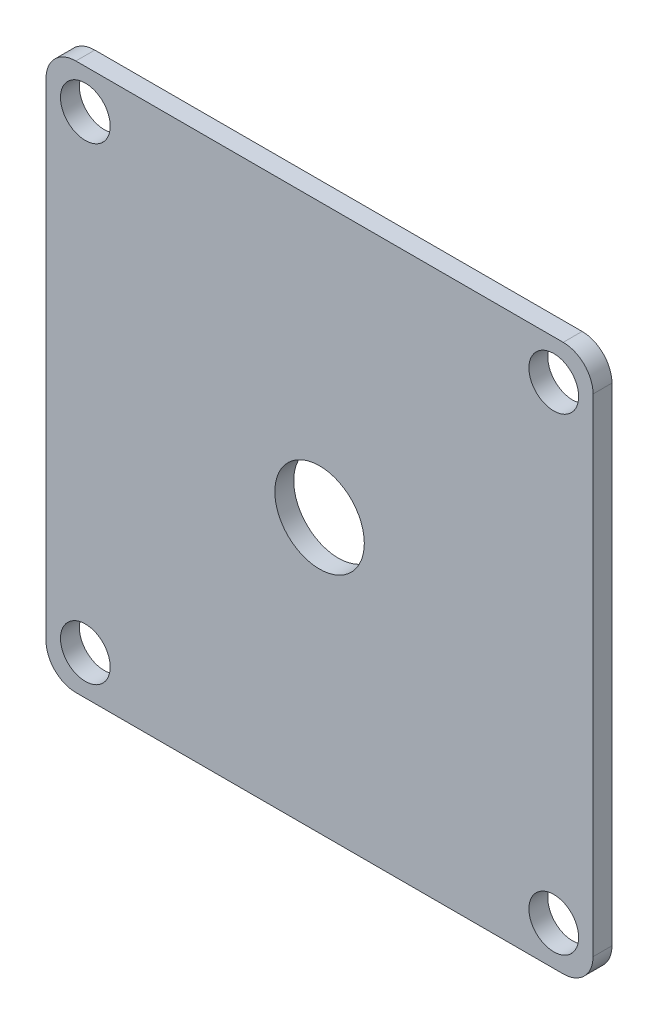
ISO-10303-21;
HEADER;
FILE_DESCRIPTION(('STEP AP214'),'2;1');
FILE_NAME('part.step','',(''),(''),'','','');
FILE_SCHEMA(('AUTOMOTIVE_DESIGN { 1 0 10303 214 1 1 1 1 }'));
ENDSEC;
DATA;
#1=APPLICATION_CONTEXT('core data for automotive mechanical design processes');
#2=APPLICATION_PROTOCOL_DEFINITION('international standard','automotive_design',2000,#1);
#3=PRODUCT_CONTEXT('',#1,'mechanical');
#4=PRODUCT('Part','Part','',(#3));
#5=PRODUCT_RELATED_PRODUCT_CATEGORY('part','',(#4));
#6=PRODUCT_DEFINITION_FORMATION('','',#4);
#7=PRODUCT_DEFINITION_CONTEXT('part definition',#1,'design');
#8=PRODUCT_DEFINITION('design','',#6,#7);
#9=PRODUCT_DEFINITION_SHAPE('','',#8);
#10=(LENGTH_UNIT() NAMED_UNIT(*) SI_UNIT(.MILLI.,.METRE.));
#11=(NAMED_UNIT(*) PLANE_ANGLE_UNIT() SI_UNIT($,.RADIAN.));
#12=(NAMED_UNIT(*) SI_UNIT($,.STERADIAN.) SOLID_ANGLE_UNIT());
#13=UNCERTAINTY_MEASURE_WITH_UNIT(LENGTH_MEASURE(1.E-05),#10,'distance_accuracy_value','');
#14=(GEOMETRIC_REPRESENTATION_CONTEXT(3) GLOBAL_UNCERTAINTY_ASSIGNED_CONTEXT((#13)) GLOBAL_UNIT_ASSIGNED_CONTEXT((#10,
#11,#12)) REPRESENTATION_CONTEXT('',''));
#15=CARTESIAN_POINT('',(0.,0.,0.));
#16=DIRECTION('',(0.,0.,1.));
#17=DIRECTION('',(1.,0.,0.));
#18=AXIS2_PLACEMENT_3D('',#15,#16,#17);
#19=CARTESIAN_POINT('',(3.,52.,1.9));
#20=DIRECTION('',(0.,0.,-1.));
#21=DIRECTION('',(-1.,0.,0.));
#22=AXIS2_PLACEMENT_3D('',#19,#20,#21);
#23=CYLINDRICAL_SURFACE('',#22,3.);
#24=CARTESIAN_POINT('',(3.,52.,0.));
#25=DIRECTION('',(0.,0.,1.));
#26=DIRECTION('',(-1.,0.,0.));
#27=AXIS2_PLACEMENT_3D('',#24,#25,#26);
#28=CIRCLE('',#27,3.);
#29=CARTESIAN_POINT('',(3.,55.,0.));
#30=VERTEX_POINT('',#29);
#31=CARTESIAN_POINT('',(0.,52.,0.));
#32=VERTEX_POINT('',#31);
#33=EDGE_CURVE('E131',#30,#32,#28,.T.);
#34=ORIENTED_EDGE('',*,*,#33,.T.);
#35=DIRECTION('',(0.,0.,-1.));
#36=VECTOR('',#35,1.);
#37=CARTESIAN_POINT('',(0.,52.,1.9));
#38=LINE('',#37,#36);
#39=CARTESIAN_POINT('',(0.,52.,1.9));
#40=VERTEX_POINT('',#39);
#41=EDGE_CURVE('E11',#40,#32,#38,.T.);
#42=ORIENTED_EDGE('',*,*,#41,.F.);
#43=CARTESIAN_POINT('',(3.,52.,1.9));
#44=DIRECTION('',(0.,0.,1.));
#45=DIRECTION('',(-1.,0.,0.));
#46=AXIS2_PLACEMENT_3D('',#43,#44,#45);
#47=CIRCLE('',#46,3.);
#48=CARTESIAN_POINT('',(3.,55.,1.9));
#49=VERTEX_POINT('',#48);
#50=EDGE_CURVE('E146',#49,#40,#47,.T.);
#51=ORIENTED_EDGE('',*,*,#50,.F.);
#52=DIRECTION('',(0.,0.,-1.));
#53=VECTOR('',#52,1.);
#54=CARTESIAN_POINT('',(3.,55.,1.9));
#55=LINE('',#54,#53);
#56=EDGE_CURVE('E127',#49,#30,#55,.T.);
#57=ORIENTED_EDGE('',*,*,#56,.T.);
#58=EDGE_LOOP('',(#34,#42,#51,#57));
#59=FACE_BOUND('',#58,.T.);
#60=ADVANCED_FACE('F35',(#59),#23,.T.);
#61=CARTESIAN_POINT('',(0.,3.00000000000002,1.9));
#62=DIRECTION('',(1.,0.,0.));
#63=DIRECTION('',(0.,0.,-1.));
#64=AXIS2_PLACEMENT_3D('',#61,#62,#63);
#65=PLANE('',#64);
#66=DIRECTION('',(0.,-1.,0.));
#67=VECTOR('',#66,1.);
#68=CARTESIAN_POINT('',(0.,3.00000000000002,0.));
#69=LINE('',#68,#67);
#70=CARTESIAN_POINT('',(0.,3.00000000000002,0.));
#71=VERTEX_POINT('',#70);
#72=EDGE_CURVE('E134',#32,#71,#69,.T.);
#73=ORIENTED_EDGE('',*,*,#72,.T.);
#74=DIRECTION('',(0.,0.,-1.));
#75=VECTOR('',#74,1.);
#76=CARTESIAN_POINT('',(0.,3.00000000000002,1.9));
#77=LINE('',#76,#75);
#78=CARTESIAN_POINT('',(0.,3.00000000000002,1.9));
#79=VERTEX_POINT('',#78);
#80=EDGE_CURVE('E43',#79,#71,#77,.T.);
#81=ORIENTED_EDGE('',*,*,#80,.F.);
#82=DIRECTION('',(0.,-1.,0.));
#83=VECTOR('',#82,1.);
#84=CARTESIAN_POINT('',(0.,3.00000000000002,1.9));
#85=LINE('',#84,#83);
#86=EDGE_CURVE('E94',#40,#79,#85,.T.);
#87=ORIENTED_EDGE('',*,*,#86,.F.);
#88=ORIENTED_EDGE('',*,*,#41,.T.);
#89=EDGE_LOOP('',(#73,#81,#87,#88));
#90=FACE_BOUND('',#89,.T.);
#91=ADVANCED_FACE('F243',(#90),#65,.F.);
#92=CARTESIAN_POINT('',(3.,3.,1.9));
#93=DIRECTION('',(0.,0.,-1.));
#94=DIRECTION('',(-1.,0.,0.));
#95=AXIS2_PLACEMENT_3D('',#92,#93,#94);
#96=CYLINDRICAL_SURFACE('',#95,3.);
#97=CARTESIAN_POINT('',(3.,3.,0.));
#98=DIRECTION('',(0.,0.,1.));
#99=DIRECTION('',(-1.,0.,0.));
#100=AXIS2_PLACEMENT_3D('',#97,#98,#99);
#101=CIRCLE('',#100,3.);
#102=CARTESIAN_POINT('',(3.00000000000002,0.,0.));
#103=VERTEX_POINT('',#102);
#104=EDGE_CURVE('E137',#71,#103,#101,.T.);
#105=ORIENTED_EDGE('',*,*,#104,.T.);
#106=DIRECTION('',(0.,0.,-1.));
#107=VECTOR('',#106,1.);
#108=CARTESIAN_POINT('',(3.00000000000002,0.,1.9));
#109=LINE('',#108,#107);
#110=CARTESIAN_POINT('',(3.00000000000002,0.,1.9));
#111=VERTEX_POINT('',#110);
#112=EDGE_CURVE('E153',#111,#103,#109,.T.);
#113=ORIENTED_EDGE('',*,*,#112,.F.);
#114=CARTESIAN_POINT('',(3.,3.,1.9));
#115=DIRECTION('',(0.,0.,1.));
#116=DIRECTION('',(-1.,0.,0.));
#117=AXIS2_PLACEMENT_3D('',#114,#115,#116);
#118=CIRCLE('',#117,3.);
#119=EDGE_CURVE('E161',#79,#111,#118,.T.);
#120=ORIENTED_EDGE('',*,*,#119,.F.);
#121=ORIENTED_EDGE('',*,*,#80,.T.);
#122=EDGE_LOOP('',(#105,#113,#120,#121));
#123=FACE_BOUND('',#122,.T.);
#124=ADVANCED_FACE('F159',(#123),#96,.T.);
#125=CARTESIAN_POINT('',(3.00000000000002,0.,1.9));
#126=DIRECTION('',(0.,1.,0.));
#127=DIRECTION('',(0.,0.,1.));
#128=AXIS2_PLACEMENT_3D('',#125,#126,#127);
#129=PLANE('',#128);
#130=DIRECTION('',(1.,0.,0.));
#131=VECTOR('',#130,1.);
#132=CARTESIAN_POINT('',(3.00000000000002,0.,0.));
#133=LINE('',#132,#131);
#134=CARTESIAN_POINT('',(52.,0.,0.));
#135=VERTEX_POINT('',#134);
#136=EDGE_CURVE('E139',#103,#135,#133,.T.);
#137=ORIENTED_EDGE('',*,*,#136,.T.);
#138=DIRECTION('',(0.,0.,-1.));
#139=VECTOR('',#138,1.);
#140=CARTESIAN_POINT('',(52.,0.,1.9));
#141=LINE('',#140,#139);
#142=CARTESIAN_POINT('',(52.,0.,1.9));
#143=VERTEX_POINT('',#142);
#144=EDGE_CURVE('E150',#143,#135,#141,.T.);
#145=ORIENTED_EDGE('',*,*,#144,.F.);
#146=DIRECTION('',(1.,0.,0.));
#147=VECTOR('',#146,1.);
#148=CARTESIAN_POINT('',(3.00000000000002,0.,1.9));
#149=LINE('',#148,#147);
#150=EDGE_CURVE('E173',#111,#143,#149,.T.);
#151=ORIENTED_EDGE('',*,*,#150,.F.);
#152=ORIENTED_EDGE('',*,*,#112,.T.);
#153=EDGE_LOOP('',(#137,#145,#151,#152));
#154=FACE_BOUND('',#153,.T.);
#155=ADVANCED_FACE('F169',(#154),#129,.F.);
#156=CARTESIAN_POINT('',(52.,3.,1.9));
#157=DIRECTION('',(0.,0.,-1.));
#158=DIRECTION('',(-1.,0.,0.));
#159=AXIS2_PLACEMENT_3D('',#156,#157,#158);
#160=CYLINDRICAL_SURFACE('',#159,3.);
#161=CARTESIAN_POINT('',(52.,3.,0.));
#162=DIRECTION('',(0.,0.,1.));
#163=DIRECTION('',(1.,0.,0.));
#164=AXIS2_PLACEMENT_3D('',#161,#162,#163);
#165=CIRCLE('',#164,3.);
#166=CARTESIAN_POINT('',(55.,3.,0.));
#167=VERTEX_POINT('',#166);
#168=EDGE_CURVE('E141',#135,#167,#165,.T.);
#169=ORIENTED_EDGE('',*,*,#168,.T.);
#170=DIRECTION('',(0.,0.,-1.));
#171=VECTOR('',#170,1.);
#172=CARTESIAN_POINT('',(55.,3.,1.9));
#173=LINE('',#172,#171);
#174=CARTESIAN_POINT('',(55.,3.,1.9));
#175=VERTEX_POINT('',#174);
#176=EDGE_CURVE('E122',#175,#167,#173,.T.);
#177=ORIENTED_EDGE('',*,*,#176,.F.);
#178=CARTESIAN_POINT('',(52.,3.,1.9));
#179=DIRECTION('',(0.,0.,1.));
#180=DIRECTION('',(1.,0.,0.));
#181=AXIS2_PLACEMENT_3D('',#178,#179,#180);
#182=CIRCLE('',#181,3.);
#183=EDGE_CURVE('E113',#143,#175,#182,.T.);
#184=ORIENTED_EDGE('',*,*,#183,.F.);
#185=ORIENTED_EDGE('',*,*,#144,.T.);
#186=EDGE_LOOP('',(#169,#177,#184,#185));
#187=FACE_BOUND('',#186,.T.);
#188=ADVANCED_FACE('F172',(#187),#160,.T.);
#189=CARTESIAN_POINT('',(55.,3.,1.9));
#190=DIRECTION('',(-1.,0.,0.));
#191=DIRECTION('',(0.,0.,1.));
#192=AXIS2_PLACEMENT_3D('',#189,#190,#191);
#193=PLANE('',#192);
#194=DIRECTION('',(0.,1.,0.));
#195=VECTOR('',#194,1.);
#196=CARTESIAN_POINT('',(55.,3.,0.));
#197=LINE('',#196,#195);
#198=CARTESIAN_POINT('',(55.,52.,0.));
#199=VERTEX_POINT('',#198);
#200=EDGE_CURVE('E121',#167,#199,#197,.T.);
#201=ORIENTED_EDGE('',*,*,#200,.T.);
#202=DIRECTION('',(0.,0.,-1.));
#203=VECTOR('',#202,1.);
#204=CARTESIAN_POINT('',(55.,52.,1.9));
#205=LINE('',#204,#203);
#206=CARTESIAN_POINT('',(55.,52.,1.9));
#207=VERTEX_POINT('',#206);
#208=EDGE_CURVE('E118',#207,#199,#205,.T.);
#209=ORIENTED_EDGE('',*,*,#208,.F.);
#210=DIRECTION('',(0.,1.,0.));
#211=VECTOR('',#210,1.);
#212=CARTESIAN_POINT('',(55.,3.,1.9));
#213=LINE('',#212,#211);
#214=EDGE_CURVE('E107',#175,#207,#213,.T.);
#215=ORIENTED_EDGE('',*,*,#214,.F.);
#216=ORIENTED_EDGE('',*,*,#176,.T.);
#217=EDGE_LOOP('',(#201,#209,#215,#216));
#218=FACE_BOUND('',#217,.T.);
#219=ADVANCED_FACE('F119',(#218),#193,.F.);
#220=CARTESIAN_POINT('',(52.,52.,1.9));
#221=DIRECTION('',(0.,0.,-1.));
#222=DIRECTION('',(-1.,0.,0.));
#223=AXIS2_PLACEMENT_3D('',#220,#221,#222);
#224=CYLINDRICAL_SURFACE('',#223,3.);
#225=CARTESIAN_POINT('',(52.,52.,0.));
#226=DIRECTION('',(0.,0.,1.));
#227=DIRECTION('',(-1.,0.,0.));
#228=AXIS2_PLACEMENT_3D('',#225,#226,#227);
#229=CIRCLE('',#228,3.);
#230=CARTESIAN_POINT('',(52.,55.,0.));
#231=VERTEX_POINT('',#230);
#232=EDGE_CURVE('E80',#199,#231,#229,.T.);
#233=ORIENTED_EDGE('',*,*,#232,.T.);
#234=DIRECTION('',(0.,0.,-1.));
#235=VECTOR('',#234,1.);
#236=CARTESIAN_POINT('',(52.,55.,1.9));
#237=LINE('',#236,#235);
#238=CARTESIAN_POINT('',(52.,55.,1.9));
#239=VERTEX_POINT('',#238);
#240=EDGE_CURVE('E123',#239,#231,#237,.T.);
#241=ORIENTED_EDGE('',*,*,#240,.F.);
#242=CARTESIAN_POINT('',(52.,52.,1.9));
#243=DIRECTION('',(0.,0.,1.));
#244=DIRECTION('',(-1.,0.,0.));
#245=AXIS2_PLACEMENT_3D('',#242,#243,#244);
#246=CIRCLE('',#245,3.);
#247=EDGE_CURVE('E111',#207,#239,#246,.T.);
#248=ORIENTED_EDGE('',*,*,#247,.F.);
#249=ORIENTED_EDGE('',*,*,#208,.T.);
#250=EDGE_LOOP('',(#233,#241,#248,#249));
#251=FACE_BOUND('',#250,.T.);
#252=ADVANCED_FACE('F125',(#251),#224,.T.);
#253=CARTESIAN_POINT('',(3.,55.,1.9));
#254=DIRECTION('',(0.,-1.,0.));
#255=DIRECTION('',(0.,0.,-1.));
#256=AXIS2_PLACEMENT_3D('',#253,#254,#255);
#257=PLANE('',#256);
#258=DIRECTION('',(-1.,0.,0.));
#259=VECTOR('',#258,1.);
#260=CARTESIAN_POINT('',(3.,55.,0.));
#261=LINE('',#260,#259);
#262=EDGE_CURVE('E86',#231,#30,#261,.T.);
#263=ORIENTED_EDGE('',*,*,#262,.T.);
#264=ORIENTED_EDGE('',*,*,#56,.F.);
#265=DIRECTION('',(-1.,0.,0.));
#266=VECTOR('',#265,1.);
#267=CARTESIAN_POINT('',(3.,55.,1.9));
#268=LINE('',#267,#266);
#269=EDGE_CURVE('E51',#239,#49,#268,.T.);
#270=ORIENTED_EDGE('',*,*,#269,.F.);
#271=ORIENTED_EDGE('',*,*,#240,.T.);
#272=EDGE_LOOP('',(#263,#264,#270,#271));
#273=FACE_BOUND('',#272,.T.);
#274=ADVANCED_FACE('F221',(#273),#257,.F.);
#275=CARTESIAN_POINT('',(3.,52.,1.9));
#276=DIRECTION('',(0.,0.,-1.));
#277=DIRECTION('',(-1.,0.,0.));
#278=AXIS2_PLACEMENT_3D('',#275,#276,#277);
#279=PLANE('',#278);
#280=CARTESIAN_POINT('',(3.94999999999985,51.05,1.9));
#281=DIRECTION('',(0.,0.,1.));
#282=DIRECTION('',(1.,0.,0.));
#283=AXIS2_PLACEMENT_3D('',#280,#281,#282);
#284=CIRCLE('',#283,2.5);
#285=CARTESIAN_POINT('',(6.44999999999985,51.05,1.9));
#286=VERTEX_POINT('',#285);
#287=EDGE_CURVE('E191',#286,#286,#284,.T.);
#288=ORIENTED_EDGE('',*,*,#287,.F.);
#289=EDGE_LOOP('',(#288));
#290=FACE_BOUND('',#289,.T.);
#291=CARTESIAN_POINT('',(51.0499999999999,51.05,1.9));
#292=DIRECTION('',(0.,0.,1.));
#293=DIRECTION('',(1.,0.,0.));
#294=AXIS2_PLACEMENT_3D('',#291,#292,#293);
#295=CIRCLE('',#294,2.5);
#296=CARTESIAN_POINT('',(53.5499999999999,51.05,1.9));
#297=VERTEX_POINT('',#296);
#298=EDGE_CURVE('E197',#297,#297,#295,.T.);
#299=ORIENTED_EDGE('',*,*,#298,.F.);
#300=EDGE_LOOP('',(#299));
#301=FACE_BOUND('',#300,.T.);
#302=CARTESIAN_POINT('',(51.05,3.95000000000001,1.9));
#303=DIRECTION('',(0.,0.,1.));
#304=DIRECTION('',(1.,0.,0.));
#305=AXIS2_PLACEMENT_3D('',#302,#303,#304);
#306=CIRCLE('',#305,2.5);
#307=CARTESIAN_POINT('',(53.55,3.95000000000001,1.9));
#308=VERTEX_POINT('',#307);
#309=EDGE_CURVE('E203',#308,#308,#306,.T.);
#310=ORIENTED_EDGE('',*,*,#309,.F.);
#311=EDGE_LOOP('',(#310));
#312=FACE_BOUND('',#311,.T.);
#313=CARTESIAN_POINT('',(3.95000000000001,3.95000000000001,1.9));
#314=DIRECTION('',(0.,0.,1.));
#315=DIRECTION('',(1.,0.,0.));
#316=AXIS2_PLACEMENT_3D('',#313,#314,#315);
#317=CIRCLE('',#316,2.5);
#318=CARTESIAN_POINT('',(6.45000000000001,3.95000000000001,1.9));
#319=VERTEX_POINT('',#318);
#320=EDGE_CURVE('E185',#319,#319,#317,.T.);
#321=ORIENTED_EDGE('',*,*,#320,.F.);
#322=EDGE_LOOP('',(#321));
#323=FACE_BOUND('',#322,.T.);
#324=CARTESIAN_POINT('',(27.5,27.5,1.9));
#325=DIRECTION('',(0.,0.,1.));
#326=DIRECTION('',(1.,0.,0.));
#327=AXIS2_PLACEMENT_3D('',#324,#325,#326);
#328=CIRCLE('',#327,4.5);
#329=CARTESIAN_POINT('',(32.,27.5,1.9));
#330=VERTEX_POINT('',#329);
#331=EDGE_CURVE('E179',#330,#330,#328,.T.);
#332=ORIENTED_EDGE('',*,*,#331,.F.);
#333=EDGE_LOOP('',(#332));
#334=FACE_BOUND('',#333,.T.);
#335=ORIENTED_EDGE('',*,*,#50,.T.);
#336=ORIENTED_EDGE('',*,*,#86,.T.);
#337=ORIENTED_EDGE('',*,*,#119,.T.);
#338=ORIENTED_EDGE('',*,*,#150,.T.);
#339=ORIENTED_EDGE('',*,*,#183,.T.);
#340=ORIENTED_EDGE('',*,*,#214,.T.);
#341=ORIENTED_EDGE('',*,*,#247,.T.);
#342=ORIENTED_EDGE('',*,*,#269,.T.);
#343=EDGE_LOOP('',(#335,#336,#337,#338,#339,#340,#341,#342));
#344=FACE_BOUND('',#343,.T.);
#345=ADVANCED_FACE('F109',(#290,#301,#312,#323,#334,#344),#279,.F.);
#346=CARTESIAN_POINT('',(3.,52.,0.));
#347=DIRECTION('',(0.,0.,-1.));
#348=DIRECTION('',(-1.,0.,0.));
#349=AXIS2_PLACEMENT_3D('',#346,#347,#348);
#350=PLANE('',#349);
#351=CARTESIAN_POINT('',(3.94999999999985,51.05,0.));
#352=DIRECTION('',(0.,0.,1.));
#353=DIRECTION('',(1.,0.,0.));
#354=AXIS2_PLACEMENT_3D('',#351,#352,#353);
#355=CIRCLE('',#354,2.5);
#356=CARTESIAN_POINT('',(6.44999999999985,51.05,0.));
#357=VERTEX_POINT('',#356);
#358=EDGE_CURVE('E194',#357,#357,#355,.T.);
#359=ORIENTED_EDGE('',*,*,#358,.T.);
#360=EDGE_LOOP('',(#359));
#361=FACE_BOUND('',#360,.T.);
#362=CARTESIAN_POINT('',(51.0499999999999,51.05,0.));
#363=DIRECTION('',(0.,0.,1.));
#364=DIRECTION('',(1.,0.,0.));
#365=AXIS2_PLACEMENT_3D('',#362,#363,#364);
#366=CIRCLE('',#365,2.5);
#367=CARTESIAN_POINT('',(53.5499999999999,51.05,0.));
#368=VERTEX_POINT('',#367);
#369=EDGE_CURVE('E200',#368,#368,#366,.T.);
#370=ORIENTED_EDGE('',*,*,#369,.T.);
#371=EDGE_LOOP('',(#370));
#372=FACE_BOUND('',#371,.T.);
#373=CARTESIAN_POINT('',(51.05,3.95000000000001,0.));
#374=DIRECTION('',(0.,0.,1.));
#375=DIRECTION('',(1.,0.,0.));
#376=AXIS2_PLACEMENT_3D('',#373,#374,#375);
#377=CIRCLE('',#376,2.5);
#378=CARTESIAN_POINT('',(53.55,3.95000000000001,0.));
#379=VERTEX_POINT('',#378);
#380=EDGE_CURVE('E188',#379,#379,#377,.T.);
#381=ORIENTED_EDGE('',*,*,#380,.T.);
#382=EDGE_LOOP('',(#381));
#383=FACE_BOUND('',#382,.T.);
#384=CARTESIAN_POINT('',(3.95000000000001,3.95000000000001,0.));
#385=DIRECTION('',(0.,0.,1.));
#386=DIRECTION('',(1.,0.,0.));
#387=AXIS2_PLACEMENT_3D('',#384,#385,#386);
#388=CIRCLE('',#387,2.5);
#389=CARTESIAN_POINT('',(6.45000000000001,3.95000000000001,0.));
#390=VERTEX_POINT('',#389);
#391=EDGE_CURVE('E182',#390,#390,#388,.T.);
#392=ORIENTED_EDGE('',*,*,#391,.T.);
#393=EDGE_LOOP('',(#392));
#394=FACE_BOUND('',#393,.T.);
#395=CARTESIAN_POINT('',(27.5,27.5,0.));
#396=DIRECTION('',(0.,0.,1.));
#397=DIRECTION('',(1.,0.,0.));
#398=AXIS2_PLACEMENT_3D('',#395,#396,#397);
#399=CIRCLE('',#398,4.5);
#400=CARTESIAN_POINT('',(32.,27.5,0.));
#401=VERTEX_POINT('',#400);
#402=EDGE_CURVE('E135',#401,#401,#399,.T.);
#403=ORIENTED_EDGE('',*,*,#402,.T.);
#404=EDGE_LOOP('',(#403));
#405=FACE_BOUND('',#404,.T.);
#406=ORIENTED_EDGE('',*,*,#33,.F.);
#407=ORIENTED_EDGE('',*,*,#262,.F.);
#408=ORIENTED_EDGE('',*,*,#232,.F.);
#409=ORIENTED_EDGE('',*,*,#200,.F.);
#410=ORIENTED_EDGE('',*,*,#168,.F.);
#411=ORIENTED_EDGE('',*,*,#136,.F.);
#412=ORIENTED_EDGE('',*,*,#104,.F.);
#413=ORIENTED_EDGE('',*,*,#72,.F.);
#414=EDGE_LOOP('',(#406,#407,#408,#409,#410,#411,#412,#413));
#415=FACE_BOUND('',#414,.T.);
#416=ADVANCED_FACE('F165',(#361,#372,#383,#394,#405,#415),#350,.T.);
#417=CARTESIAN_POINT('',(27.5,27.5,0.));
#418=DIRECTION('',(0.,0.,1.));
#419=DIRECTION('',(1.,0.,0.));
#420=AXIS2_PLACEMENT_3D('',#417,#418,#419);
#421=CYLINDRICAL_SURFACE('',#420,4.5);
#422=CARTESIAN_POINT('',(32.,27.5,0.));
#423=CARTESIAN_POINT('',(32.,27.5,0.0197916666666666));
#424=CARTESIAN_POINT('',(32.,27.5,0.0395833333333333));
#425=CARTESIAN_POINT('',(32.,27.5,0.0791666666666667));
#426=CARTESIAN_POINT('',(32.,27.5,0.0989583333333333));
#427=CARTESIAN_POINT('',(32.,27.5,0.138541666666667));
#428=CARTESIAN_POINT('',(32.,27.5,0.158333333333333));
#429=CARTESIAN_POINT('',(32.,27.5,0.197916666666667));
#430=CARTESIAN_POINT('',(32.,27.5,0.217708333333333));
#431=CARTESIAN_POINT('',(32.,27.5,0.257291666666667));
#432=CARTESIAN_POINT('',(32.,27.5,0.277083333333333));
#433=CARTESIAN_POINT('',(32.,27.5,0.316666666666667));
#434=CARTESIAN_POINT('',(32.,27.5,0.336458333333333));
#435=CARTESIAN_POINT('',(32.,27.5,0.376041666666667));
#436=CARTESIAN_POINT('',(32.,27.5,0.395833333333333));
#437=CARTESIAN_POINT('',(32.,27.5,0.435416666666667));
#438=CARTESIAN_POINT('',(32.,27.5,0.455208333333333));
#439=CARTESIAN_POINT('',(32.,27.5,0.494791666666667));
#440=CARTESIAN_POINT('',(32.,27.5,0.514583333333333));
#441=CARTESIAN_POINT('',(32.,27.5,0.554166666666667));
#442=CARTESIAN_POINT('',(32.,27.5,0.573958333333333));
#443=CARTESIAN_POINT('',(32.,27.5,0.613541666666667));
#444=CARTESIAN_POINT('',(32.,27.5,0.633333333333333));
#445=CARTESIAN_POINT('',(32.,27.5,0.672916666666667));
#446=CARTESIAN_POINT('',(32.,27.5,0.692708333333333));
#447=CARTESIAN_POINT('',(32.,27.5,0.732291666666667));
#448=CARTESIAN_POINT('',(32.,27.5,0.752083333333333));
#449=CARTESIAN_POINT('',(32.,27.5,0.791666666666667));
#450=CARTESIAN_POINT('',(32.,27.5,0.811458333333333));
#451=CARTESIAN_POINT('',(32.,27.5,0.851041666666667));
#452=CARTESIAN_POINT('',(32.,27.5,0.870833333333333));
#453=CARTESIAN_POINT('',(32.,27.5,0.910416666666667));
#454=CARTESIAN_POINT('',(32.,27.5,0.930208333333333));
#455=CARTESIAN_POINT('',(32.,27.5,0.969791666666667));
#456=CARTESIAN_POINT('',(32.,27.5,0.989583333333333));
#457=CARTESIAN_POINT('',(32.,27.5,1.02916666666667));
#458=CARTESIAN_POINT('',(32.,27.5,1.04895833333333));
#459=CARTESIAN_POINT('',(32.,27.5,1.08854166666667));
#460=CARTESIAN_POINT('',(32.,27.5,1.10833333333333));
#461=CARTESIAN_POINT('',(32.,27.5,1.14791666666667));
#462=CARTESIAN_POINT('',(32.,27.5,1.16770833333333));
#463=CARTESIAN_POINT('',(32.,27.5,1.20729166666667));
#464=CARTESIAN_POINT('',(32.,27.5,1.22708333333333));
#465=CARTESIAN_POINT('',(32.,27.5,1.26666666666667));
#466=CARTESIAN_POINT('',(32.,27.5,1.28645833333333));
#467=CARTESIAN_POINT('',(32.,27.5,1.32604166666667));
#468=CARTESIAN_POINT('',(32.,27.5,1.34583333333333));
#469=CARTESIAN_POINT('',(32.,27.5,1.38541666666667));
#470=CARTESIAN_POINT('',(32.,27.5,1.40520833333333));
#471=CARTESIAN_POINT('',(32.,27.5,1.44479166666667));
#472=CARTESIAN_POINT('',(32.,27.5,1.46458333333333));
#473=CARTESIAN_POINT('',(32.,27.5,1.50416666666667));
#474=CARTESIAN_POINT('',(32.,27.5,1.52395833333333));
#475=CARTESIAN_POINT('',(32.,27.5,1.56354166666667));
#476=CARTESIAN_POINT('',(32.,27.5,1.58333333333333));
#477=CARTESIAN_POINT('',(32.,27.5,1.62291666666667));
#478=CARTESIAN_POINT('',(32.,27.5,1.64270833333333));
#479=CARTESIAN_POINT('',(32.,27.5,1.68229166666667));
#480=CARTESIAN_POINT('',(32.,27.5,1.70208333333333));
#481=CARTESIAN_POINT('',(32.,27.5,1.74166666666667));
#482=CARTESIAN_POINT('',(32.,27.5,1.76145833333333));
#483=CARTESIAN_POINT('',(32.,27.5,1.80104166666667));
#484=CARTESIAN_POINT('',(32.,27.5,1.82083333333333));
#485=CARTESIAN_POINT('',(32.,27.5,1.86041666666667));
#486=CARTESIAN_POINT('',(32.,27.5,1.88020833333333));
#487=CARTESIAN_POINT('',(32.,27.5,1.9));
#488=B_SPLINE_CURVE_WITH_KNOTS('',3,(#422,#423,#424,#425,#426,#427,#428,#429,#430,#431,#432,
#433,#434,#435,#436,#437,#438,#439,#440,#441,#442,#443,#444,#445,#446,#447,#448,#449,#450,#451,
#452,#453,#454,#455,#456,#457,#458,#459,#460,#461,#462,#463,#464,#465,#466,#467,#468,#469,#470,
#471,#472,#473,#474,#475,#476,#477,#478,#479,#480,#481,#482,#483,#484,#485,#486,#487),
.UNSPECIFIED.,.F.,.F.,(4,2,2,2,2,2,2,2,2,2,2,2,2,2,2,2,2,2,2,2,2,2,2,2,2,2,2,2,2,2,2,2,4),(0.,
0.059375,0.11875,0.178125,0.2375,0.296875,0.35625,0.415625,0.475,0.534375,0.59375,0.653125,
0.7125,0.771875,0.83125,0.890625,0.95,1.009375,1.06875,1.128125,1.1875,1.246875,1.30625,
1.365625,1.425,1.484375,1.54375,1.603125,1.6625,1.721875,1.78125,1.840625,1.9),.UNSPECIFIED.);
#489=EDGE_CURVE('BSEAM228',#401,#330,#488,.T.);
#490=ORIENTED_EDGE('',*,*,#402,.F.);
#491=ORIENTED_EDGE('',*,*,#331,.T.);
#492=ORIENTED_EDGE('',*,*,#489,.T.);
#493=ORIENTED_EDGE('',*,*,#489,.F.);
#494=EDGE_LOOP('',(#490,#492,#491,#493));
#495=FACE_BOUND('',#494,.T.);
#496=ADVANCED_FACE('F228',(#495),#421,.F.);
#497=CARTESIAN_POINT('',(3.95000000000001,3.95000000000001,0.));
#498=DIRECTION('',(0.,0.,1.));
#499=DIRECTION('',(1.,0.,0.));
#500=AXIS2_PLACEMENT_3D('',#497,#498,#499);
#501=CYLINDRICAL_SURFACE('',#500,2.5);
#502=CARTESIAN_POINT('',(6.45000000000001,3.95000000000001,0.));
#503=CARTESIAN_POINT('',(6.45000000000001,3.95000000000001,0.0197916666666666));
#504=CARTESIAN_POINT('',(6.45000000000001,3.95000000000001,0.0395833333333333));
#505=CARTESIAN_POINT('',(6.45000000000001,3.95000000000001,0.0791666666666667));
#506=CARTESIAN_POINT('',(6.45000000000001,3.95000000000001,0.0989583333333333));
#507=CARTESIAN_POINT('',(6.45000000000001,3.95000000000001,0.138541666666667));
#508=CARTESIAN_POINT('',(6.45000000000001,3.95000000000001,0.158333333333333));
#509=CARTESIAN_POINT('',(6.45000000000001,3.95000000000001,0.197916666666667));
#510=CARTESIAN_POINT('',(6.45000000000001,3.95000000000001,0.217708333333333));
#511=CARTESIAN_POINT('',(6.45000000000001,3.95000000000001,0.257291666666667));
#512=CARTESIAN_POINT('',(6.45000000000001,3.95000000000001,0.277083333333333));
#513=CARTESIAN_POINT('',(6.45000000000001,3.95000000000001,0.316666666666667));
#514=CARTESIAN_POINT('',(6.45000000000001,3.95000000000001,0.336458333333333));
#515=CARTESIAN_POINT('',(6.45000000000001,3.95000000000001,0.376041666666667));
#516=CARTESIAN_POINT('',(6.45000000000001,3.95000000000001,0.395833333333333));
#517=CARTESIAN_POINT('',(6.45000000000001,3.95000000000001,0.435416666666667));
#518=CARTESIAN_POINT('',(6.45000000000001,3.95000000000001,0.455208333333333));
#519=CARTESIAN_POINT('',(6.45000000000001,3.95000000000001,0.494791666666667));
#520=CARTESIAN_POINT('',(6.45000000000001,3.95000000000001,0.514583333333333));
#521=CARTESIAN_POINT('',(6.45000000000001,3.95000000000001,0.554166666666667));
#522=CARTESIAN_POINT('',(6.45000000000001,3.95000000000001,0.573958333333333));
#523=CARTESIAN_POINT('',(6.45000000000001,3.95000000000001,0.613541666666667));
#524=CARTESIAN_POINT('',(6.45000000000001,3.95000000000001,0.633333333333333));
#525=CARTESIAN_POINT('',(6.45000000000001,3.95000000000001,0.672916666666667));
#526=CARTESIAN_POINT('',(6.45000000000001,3.95000000000001,0.692708333333333));
#527=CARTESIAN_POINT('',(6.45000000000001,3.95000000000001,0.732291666666667));
#528=CARTESIAN_POINT('',(6.45000000000001,3.95000000000001,0.752083333333333));
#529=CARTESIAN_POINT('',(6.45000000000001,3.95000000000001,0.791666666666667));
#530=CARTESIAN_POINT('',(6.45000000000001,3.95000000000001,0.811458333333333));
#531=CARTESIAN_POINT('',(6.45000000000001,3.95000000000001,0.851041666666667));
#532=CARTESIAN_POINT('',(6.45000000000001,3.95000000000001,0.870833333333333));
#533=CARTESIAN_POINT('',(6.45000000000001,3.95000000000001,0.910416666666667));
#534=CARTESIAN_POINT('',(6.45000000000001,3.95000000000001,0.930208333333333));
#535=CARTESIAN_POINT('',(6.45000000000001,3.95000000000001,0.969791666666667));
#536=CARTESIAN_POINT('',(6.45000000000001,3.95000000000001,0.989583333333333));
#537=CARTESIAN_POINT('',(6.45000000000001,3.95000000000001,1.02916666666667));
#538=CARTESIAN_POINT('',(6.45000000000001,3.95000000000001,1.04895833333333));
#539=CARTESIAN_POINT('',(6.45000000000001,3.95000000000001,1.08854166666667));
#540=CARTESIAN_POINT('',(6.45000000000001,3.95000000000001,1.10833333333333));
#541=CARTESIAN_POINT('',(6.45000000000001,3.95000000000001,1.14791666666667));
#542=CARTESIAN_POINT('',(6.45000000000001,3.95000000000001,1.16770833333333));
#543=CARTESIAN_POINT('',(6.45000000000001,3.95000000000001,1.20729166666667));
#544=CARTESIAN_POINT('',(6.45000000000001,3.95000000000001,1.22708333333333));
#545=CARTESIAN_POINT('',(6.45000000000001,3.95000000000001,1.26666666666667));
#546=CARTESIAN_POINT('',(6.45000000000001,3.95000000000001,1.28645833333333));
#547=CARTESIAN_POINT('',(6.45000000000001,3.95000000000001,1.32604166666667));
#548=CARTESIAN_POINT('',(6.45000000000001,3.95000000000001,1.34583333333333));
#549=CARTESIAN_POINT('',(6.45000000000001,3.95000000000001,1.38541666666667));
#550=CARTESIAN_POINT('',(6.45000000000001,3.95000000000001,1.40520833333333));
#551=CARTESIAN_POINT('',(6.45000000000001,3.95000000000001,1.44479166666667));
#552=CARTESIAN_POINT('',(6.45000000000001,3.95000000000001,1.46458333333333));
#553=CARTESIAN_POINT('',(6.45000000000001,3.95000000000001,1.50416666666667));
#554=CARTESIAN_POINT('',(6.45000000000001,3.95000000000001,1.52395833333333));
#555=CARTESIAN_POINT('',(6.45000000000001,3.95000000000001,1.56354166666667));
#556=CARTESIAN_POINT('',(6.45000000000001,3.95000000000001,1.58333333333333));
#557=CARTESIAN_POINT('',(6.45000000000001,3.95000000000001,1.62291666666667));
#558=CARTESIAN_POINT('',(6.45000000000001,3.95000000000001,1.64270833333333));
#559=CARTESIAN_POINT('',(6.45000000000001,3.95000000000001,1.68229166666667));
#560=CARTESIAN_POINT('',(6.45000000000001,3.95000000000001,1.70208333333333));
#561=CARTESIAN_POINT('',(6.45000000000001,3.95000000000001,1.74166666666667));
#562=CARTESIAN_POINT('',(6.45000000000001,3.95000000000001,1.76145833333333));
#563=CARTESIAN_POINT('',(6.45000000000001,3.95000000000001,1.80104166666667));
#564=CARTESIAN_POINT('',(6.45000000000001,3.95000000000001,1.82083333333333));
#565=CARTESIAN_POINT('',(6.45000000000001,3.95000000000001,1.86041666666667));
#566=CARTESIAN_POINT('',(6.45000000000001,3.95000000000001,1.88020833333333));
#567=CARTESIAN_POINT('',(6.45000000000001,3.95000000000001,1.9));
#568=B_SPLINE_CURVE_WITH_KNOTS('',3,(#502,#503,#504,#505,#506,#507,#508,#509,#510,#511,#512,
#513,#514,#515,#516,#517,#518,#519,#520,#521,#522,#523,#524,#525,#526,#527,#528,#529,#530,#531,
#532,#533,#534,#535,#536,#537,#538,#539,#540,#541,#542,#543,#544,#545,#546,#547,#548,#549,#550,
#551,#552,#553,#554,#555,#556,#557,#558,#559,#560,#561,#562,#563,#564,#565,#566,#567),
.UNSPECIFIED.,.F.,.F.,(4,2,2,2,2,2,2,2,2,2,2,2,2,2,2,2,2,2,2,2,2,2,2,2,2,2,2,2,2,2,2,2,4),(0.,
0.059375,0.11875,0.178125,0.2375,0.296875,0.35625,0.415625,0.475,0.534375,0.59375,0.653125,
0.7125,0.771875,0.83125,0.890625,0.95,1.009375,1.06875,1.128125,1.1875,1.246875,1.30625,
1.365625,1.425,1.484375,1.54375,1.603125,1.6625,1.721875,1.78125,1.840625,1.9),.UNSPECIFIED.);
#569=EDGE_CURVE('BSEAM215',#390,#319,#568,.T.);
#570=ORIENTED_EDGE('',*,*,#391,.F.);
#571=ORIENTED_EDGE('',*,*,#320,.T.);
#572=ORIENTED_EDGE('',*,*,#569,.T.);
#573=ORIENTED_EDGE('',*,*,#569,.F.);
#574=EDGE_LOOP('',(#570,#572,#571,#573));
#575=FACE_BOUND('',#574,.T.);
#576=ADVANCED_FACE('F215',(#575),#501,.F.);
#577=CARTESIAN_POINT('',(51.05,3.95000000000001,0.));
#578=DIRECTION('',(0.,0.,1.));
#579=DIRECTION('',(1.,0.,0.));
#580=AXIS2_PLACEMENT_3D('',#577,#578,#579);
#581=CYLINDRICAL_SURFACE('',#580,2.5);
#582=CARTESIAN_POINT('',(53.55,3.95000000000001,0.));
#583=CARTESIAN_POINT('',(53.55,3.95000000000001,0.0197916666666666));
#584=CARTESIAN_POINT('',(53.55,3.95000000000001,0.0395833333333333));
#585=CARTESIAN_POINT('',(53.55,3.95000000000001,0.0791666666666667));
#586=CARTESIAN_POINT('',(53.55,3.95000000000001,0.0989583333333333));
#587=CARTESIAN_POINT('',(53.55,3.95000000000001,0.138541666666667));
#588=CARTESIAN_POINT('',(53.55,3.95000000000001,0.158333333333333));
#589=CARTESIAN_POINT('',(53.55,3.95000000000001,0.197916666666667));
#590=CARTESIAN_POINT('',(53.55,3.95000000000001,0.217708333333333));
#591=CARTESIAN_POINT('',(53.55,3.95000000000001,0.257291666666667));
#592=CARTESIAN_POINT('',(53.55,3.95000000000001,0.277083333333333));
#593=CARTESIAN_POINT('',(53.55,3.95000000000001,0.316666666666667));
#594=CARTESIAN_POINT('',(53.55,3.95000000000001,0.336458333333333));
#595=CARTESIAN_POINT('',(53.55,3.95000000000001,0.376041666666667));
#596=CARTESIAN_POINT('',(53.55,3.95000000000001,0.395833333333333));
#597=CARTESIAN_POINT('',(53.55,3.95000000000001,0.435416666666667));
#598=CARTESIAN_POINT('',(53.55,3.95000000000001,0.455208333333333));
#599=CARTESIAN_POINT('',(53.55,3.95000000000001,0.494791666666667));
#600=CARTESIAN_POINT('',(53.55,3.95000000000001,0.514583333333333));
#601=CARTESIAN_POINT('',(53.55,3.95000000000001,0.554166666666667));
#602=CARTESIAN_POINT('',(53.55,3.95000000000001,0.573958333333333));
#603=CARTESIAN_POINT('',(53.55,3.95000000000001,0.613541666666667));
#604=CARTESIAN_POINT('',(53.55,3.95000000000001,0.633333333333333));
#605=CARTESIAN_POINT('',(53.55,3.95000000000001,0.672916666666667));
#606=CARTESIAN_POINT('',(53.55,3.95000000000001,0.692708333333333));
#607=CARTESIAN_POINT('',(53.55,3.95000000000001,0.732291666666667));
#608=CARTESIAN_POINT('',(53.55,3.95000000000001,0.752083333333333));
#609=CARTESIAN_POINT('',(53.55,3.95000000000001,0.791666666666667));
#610=CARTESIAN_POINT('',(53.55,3.95000000000001,0.811458333333333));
#611=CARTESIAN_POINT('',(53.55,3.95000000000001,0.851041666666667));
#612=CARTESIAN_POINT('',(53.55,3.95000000000001,0.870833333333333));
#613=CARTESIAN_POINT('',(53.55,3.95000000000001,0.910416666666667));
#614=CARTESIAN_POINT('',(53.55,3.95000000000001,0.930208333333333));
#615=CARTESIAN_POINT('',(53.55,3.95000000000001,0.969791666666667));
#616=CARTESIAN_POINT('',(53.55,3.95000000000001,0.989583333333333));
#617=CARTESIAN_POINT('',(53.55,3.95000000000001,1.02916666666667));
#618=CARTESIAN_POINT('',(53.55,3.95000000000001,1.04895833333333));
#619=CARTESIAN_POINT('',(53.55,3.95000000000001,1.08854166666667));
#620=CARTESIAN_POINT('',(53.55,3.95000000000001,1.10833333333333));
#621=CARTESIAN_POINT('',(53.55,3.95000000000001,1.14791666666667));
#622=CARTESIAN_POINT('',(53.55,3.95000000000001,1.16770833333333));
#623=CARTESIAN_POINT('',(53.55,3.95000000000001,1.20729166666667));
#624=CARTESIAN_POINT('',(53.55,3.95000000000001,1.22708333333333));
#625=CARTESIAN_POINT('',(53.55,3.95000000000001,1.26666666666667));
#626=CARTESIAN_POINT('',(53.55,3.95000000000001,1.28645833333333));
#627=CARTESIAN_POINT('',(53.55,3.95000000000001,1.32604166666667));
#628=CARTESIAN_POINT('',(53.55,3.95000000000001,1.34583333333333));
#629=CARTESIAN_POINT('',(53.55,3.95000000000001,1.38541666666667));
#630=CARTESIAN_POINT('',(53.55,3.95000000000001,1.40520833333333));
#631=CARTESIAN_POINT('',(53.55,3.95000000000001,1.44479166666667));
#632=CARTESIAN_POINT('',(53.55,3.95000000000001,1.46458333333333));
#633=CARTESIAN_POINT('',(53.55,3.95000000000001,1.50416666666667));
#634=CARTESIAN_POINT('',(53.55,3.95000000000001,1.52395833333333));
#635=CARTESIAN_POINT('',(53.55,3.95000000000001,1.56354166666667));
#636=CARTESIAN_POINT('',(53.55,3.95000000000001,1.58333333333333));
#637=CARTESIAN_POINT('',(53.55,3.95000000000001,1.62291666666667));
#638=CARTESIAN_POINT('',(53.55,3.95000000000001,1.64270833333333));
#639=CARTESIAN_POINT('',(53.55,3.95000000000001,1.68229166666667));
#640=CARTESIAN_POINT('',(53.55,3.95000000000001,1.70208333333333));
#641=CARTESIAN_POINT('',(53.55,3.95000000000001,1.74166666666667));
#642=CARTESIAN_POINT('',(53.55,3.95000000000001,1.76145833333333));
#643=CARTESIAN_POINT('',(53.55,3.95000000000001,1.80104166666667));
#644=CARTESIAN_POINT('',(53.55,3.95000000000001,1.82083333333333));
#645=CARTESIAN_POINT('',(53.55,3.95000000000001,1.86041666666667));
#646=CARTESIAN_POINT('',(53.55,3.95000000000001,1.88020833333333));
#647=CARTESIAN_POINT('',(53.55,3.95000000000001,1.9));
#648=B_SPLINE_CURVE_WITH_KNOTS('',3,(#582,#583,#584,#585,#586,#587,#588,#589,#590,#591,#592,
#593,#594,#595,#596,#597,#598,#599,#600,#601,#602,#603,#604,#605,#606,#607,#608,#609,#610,#611,
#612,#613,#614,#615,#616,#617,#618,#619,#620,#621,#622,#623,#624,#625,#626,#627,#628,#629,#630,
#631,#632,#633,#634,#635,#636,#637,#638,#639,#640,#641,#642,#643,#644,#645,#646,#647),
.UNSPECIFIED.,.F.,.F.,(4,2,2,2,2,2,2,2,2,2,2,2,2,2,2,2,2,2,2,2,2,2,2,2,2,2,2,2,2,2,2,2,4),(0.,
0.059375,0.11875,0.178125,0.2375,0.296875,0.35625,0.415625,0.475,0.534375,0.59375,0.653125,
0.7125,0.771875,0.83125,0.890625,0.95,1.009375,1.06875,1.128125,1.1875,1.246875,1.30625,
1.365625,1.425,1.484375,1.54375,1.603125,1.6625,1.721875,1.78125,1.840625,1.9),.UNSPECIFIED.);
#649=EDGE_CURVE('BSEAM211',#379,#308,#648,.T.);
#650=ORIENTED_EDGE('',*,*,#380,.F.);
#651=ORIENTED_EDGE('',*,*,#309,.T.);
#652=ORIENTED_EDGE('',*,*,#649,.T.);
#653=ORIENTED_EDGE('',*,*,#649,.F.);
#654=EDGE_LOOP('',(#650,#652,#651,#653));
#655=FACE_BOUND('',#654,.T.);
#656=ADVANCED_FACE('F211',(#655),#581,.F.);
#657=CARTESIAN_POINT('',(51.0499999999999,51.05,0.));
#658=DIRECTION('',(0.,0.,1.));
#659=DIRECTION('',(1.,0.,0.));
#660=AXIS2_PLACEMENT_3D('',#657,#658,#659);
#661=CYLINDRICAL_SURFACE('',#660,2.5);
#662=CARTESIAN_POINT('',(53.5499999999999,51.05,0.));
#663=CARTESIAN_POINT('',(53.5499999999999,51.05,0.0197916666666666));
#664=CARTESIAN_POINT('',(53.5499999999999,51.05,0.0395833333333333));
#665=CARTESIAN_POINT('',(53.5499999999999,51.05,0.0791666666666667));
#666=CARTESIAN_POINT('',(53.5499999999999,51.05,0.0989583333333333));
#667=CARTESIAN_POINT('',(53.5499999999999,51.05,0.138541666666667));
#668=CARTESIAN_POINT('',(53.5499999999999,51.05,0.158333333333333));
#669=CARTESIAN_POINT('',(53.5499999999999,51.05,0.197916666666667));
#670=CARTESIAN_POINT('',(53.5499999999999,51.05,0.217708333333333));
#671=CARTESIAN_POINT('',(53.5499999999999,51.05,0.257291666666667));
#672=CARTESIAN_POINT('',(53.5499999999999,51.05,0.277083333333333));
#673=CARTESIAN_POINT('',(53.5499999999999,51.05,0.316666666666667));
#674=CARTESIAN_POINT('',(53.5499999999999,51.05,0.336458333333333));
#675=CARTESIAN_POINT('',(53.5499999999999,51.05,0.376041666666667));
#676=CARTESIAN_POINT('',(53.5499999999999,51.05,0.395833333333333));
#677=CARTESIAN_POINT('',(53.5499999999999,51.05,0.435416666666667));
#678=CARTESIAN_POINT('',(53.5499999999999,51.05,0.455208333333333));
#679=CARTESIAN_POINT('',(53.5499999999999,51.05,0.494791666666667));
#680=CARTESIAN_POINT('',(53.5499999999999,51.05,0.514583333333333));
#681=CARTESIAN_POINT('',(53.5499999999999,51.05,0.554166666666667));
#682=CARTESIAN_POINT('',(53.5499999999999,51.05,0.573958333333333));
#683=CARTESIAN_POINT('',(53.5499999999999,51.05,0.613541666666667));
#684=CARTESIAN_POINT('',(53.5499999999999,51.05,0.633333333333333));
#685=CARTESIAN_POINT('',(53.5499999999999,51.05,0.672916666666667));
#686=CARTESIAN_POINT('',(53.5499999999999,51.05,0.692708333333333));
#687=CARTESIAN_POINT('',(53.5499999999999,51.05,0.732291666666667));
#688=CARTESIAN_POINT('',(53.5499999999999,51.05,0.752083333333333));
#689=CARTESIAN_POINT('',(53.5499999999999,51.05,0.791666666666667));
#690=CARTESIAN_POINT('',(53.5499999999999,51.05,0.811458333333333));
#691=CARTESIAN_POINT('',(53.5499999999999,51.05,0.851041666666667));
#692=CARTESIAN_POINT('',(53.5499999999999,51.05,0.870833333333333));
#693=CARTESIAN_POINT('',(53.5499999999999,51.05,0.910416666666667));
#694=CARTESIAN_POINT('',(53.5499999999999,51.05,0.930208333333333));
#695=CARTESIAN_POINT('',(53.5499999999999,51.05,0.969791666666667));
#696=CARTESIAN_POINT('',(53.5499999999999,51.05,0.989583333333333));
#697=CARTESIAN_POINT('',(53.5499999999999,51.05,1.02916666666667));
#698=CARTESIAN_POINT('',(53.5499999999999,51.05,1.04895833333333));
#699=CARTESIAN_POINT('',(53.5499999999999,51.05,1.08854166666667));
#700=CARTESIAN_POINT('',(53.5499999999999,51.05,1.10833333333333));
#701=CARTESIAN_POINT('',(53.5499999999999,51.05,1.14791666666667));
#702=CARTESIAN_POINT('',(53.5499999999999,51.05,1.16770833333333));
#703=CARTESIAN_POINT('',(53.5499999999999,51.05,1.20729166666667));
#704=CARTESIAN_POINT('',(53.5499999999999,51.05,1.22708333333333));
#705=CARTESIAN_POINT('',(53.5499999999999,51.05,1.26666666666667));
#706=CARTESIAN_POINT('',(53.5499999999999,51.05,1.28645833333333));
#707=CARTESIAN_POINT('',(53.5499999999999,51.05,1.32604166666667));
#708=CARTESIAN_POINT('',(53.5499999999999,51.05,1.34583333333333));
#709=CARTESIAN_POINT('',(53.5499999999999,51.05,1.38541666666667));
#710=CARTESIAN_POINT('',(53.5499999999999,51.05,1.40520833333333));
#711=CARTESIAN_POINT('',(53.5499999999999,51.05,1.44479166666667));
#712=CARTESIAN_POINT('',(53.5499999999999,51.05,1.46458333333333));
#713=CARTESIAN_POINT('',(53.5499999999999,51.05,1.50416666666667));
#714=CARTESIAN_POINT('',(53.5499999999999,51.05,1.52395833333333));
#715=CARTESIAN_POINT('',(53.5499999999999,51.05,1.56354166666667));
#716=CARTESIAN_POINT('',(53.5499999999999,51.05,1.58333333333333));
#717=CARTESIAN_POINT('',(53.5499999999999,51.05,1.62291666666667));
#718=CARTESIAN_POINT('',(53.5499999999999,51.05,1.64270833333333));
#719=CARTESIAN_POINT('',(53.5499999999999,51.05,1.68229166666667));
#720=CARTESIAN_POINT('',(53.5499999999999,51.05,1.70208333333333));
#721=CARTESIAN_POINT('',(53.5499999999999,51.05,1.74166666666667));
#722=CARTESIAN_POINT('',(53.5499999999999,51.05,1.76145833333333));
#723=CARTESIAN_POINT('',(53.5499999999999,51.05,1.80104166666667));
#724=CARTESIAN_POINT('',(53.5499999999999,51.05,1.82083333333333));
#725=CARTESIAN_POINT('',(53.5499999999999,51.05,1.86041666666667));
#726=CARTESIAN_POINT('',(53.5499999999999,51.05,1.88020833333333));
#727=CARTESIAN_POINT('',(53.5499999999999,51.05,1.9));
#728=B_SPLINE_CURVE_WITH_KNOTS('',3,(#662,#663,#664,#665,#666,#667,#668,#669,#670,#671,#672,
#673,#674,#675,#676,#677,#678,#679,#680,#681,#682,#683,#684,#685,#686,#687,#688,#689,#690,#691,
#692,#693,#694,#695,#696,#697,#698,#699,#700,#701,#702,#703,#704,#705,#706,#707,#708,#709,#710,
#711,#712,#713,#714,#715,#716,#717,#718,#719,#720,#721,#722,#723,#724,#725,#726,#727),
.UNSPECIFIED.,.F.,.F.,(4,2,2,2,2,2,2,2,2,2,2,2,2,2,2,2,2,2,2,2,2,2,2,2,2,2,2,2,2,2,2,2,4),(0.,
0.059375,0.11875,0.178125,0.2375,0.296875,0.35625,0.415625,0.475,0.534375,0.59375,0.653125,
0.7125,0.771875,0.83125,0.890625,0.95,1.009375,1.06875,1.128125,1.1875,1.246875,1.30625,
1.365625,1.425,1.484375,1.54375,1.603125,1.6625,1.721875,1.78125,1.840625,1.9),.UNSPECIFIED.);
#729=EDGE_CURVE('BSEAM214',#368,#297,#728,.T.);
#730=ORIENTED_EDGE('',*,*,#369,.F.);
#731=ORIENTED_EDGE('',*,*,#298,.T.);
#732=ORIENTED_EDGE('',*,*,#729,.T.);
#733=ORIENTED_EDGE('',*,*,#729,.F.);
#734=EDGE_LOOP('',(#730,#732,#731,#733));
#735=FACE_BOUND('',#734,.T.);
#736=ADVANCED_FACE('F214',(#735),#661,.F.);
#737=CARTESIAN_POINT('',(3.94999999999985,51.05,0.));
#738=DIRECTION('',(0.,0.,1.));
#739=DIRECTION('',(1.,0.,0.));
#740=AXIS2_PLACEMENT_3D('',#737,#738,#739);
#741=CYLINDRICAL_SURFACE('',#740,2.5);
#742=CARTESIAN_POINT('',(6.44999999999985,51.05,0.));
#743=CARTESIAN_POINT('',(6.44999999999985,51.05,0.0197916666666666));
#744=CARTESIAN_POINT('',(6.44999999999985,51.05,0.0395833333333333));
#745=CARTESIAN_POINT('',(6.44999999999985,51.05,0.0791666666666667));
#746=CARTESIAN_POINT('',(6.44999999999985,51.05,0.0989583333333333));
#747=CARTESIAN_POINT('',(6.44999999999985,51.05,0.138541666666667));
#748=CARTESIAN_POINT('',(6.44999999999985,51.05,0.158333333333333));
#749=CARTESIAN_POINT('',(6.44999999999985,51.05,0.197916666666667));
#750=CARTESIAN_POINT('',(6.44999999999985,51.05,0.217708333333333));
#751=CARTESIAN_POINT('',(6.44999999999985,51.05,0.257291666666667));
#752=CARTESIAN_POINT('',(6.44999999999985,51.05,0.277083333333333));
#753=CARTESIAN_POINT('',(6.44999999999985,51.05,0.316666666666667));
#754=CARTESIAN_POINT('',(6.44999999999985,51.05,0.336458333333333));
#755=CARTESIAN_POINT('',(6.44999999999985,51.05,0.376041666666667));
#756=CARTESIAN_POINT('',(6.44999999999985,51.05,0.395833333333333));
#757=CARTESIAN_POINT('',(6.44999999999985,51.05,0.435416666666667));
#758=CARTESIAN_POINT('',(6.44999999999985,51.05,0.455208333333333));
#759=CARTESIAN_POINT('',(6.44999999999985,51.05,0.494791666666667));
#760=CARTESIAN_POINT('',(6.44999999999985,51.05,0.514583333333333));
#761=CARTESIAN_POINT('',(6.44999999999985,51.05,0.554166666666667));
#762=CARTESIAN_POINT('',(6.44999999999985,51.05,0.573958333333333));
#763=CARTESIAN_POINT('',(6.44999999999985,51.05,0.613541666666667));
#764=CARTESIAN_POINT('',(6.44999999999985,51.05,0.633333333333333));
#765=CARTESIAN_POINT('',(6.44999999999985,51.05,0.672916666666667));
#766=CARTESIAN_POINT('',(6.44999999999985,51.05,0.692708333333333));
#767=CARTESIAN_POINT('',(6.44999999999985,51.05,0.732291666666667));
#768=CARTESIAN_POINT('',(6.44999999999985,51.05,0.752083333333333));
#769=CARTESIAN_POINT('',(6.44999999999985,51.05,0.791666666666667));
#770=CARTESIAN_POINT('',(6.44999999999985,51.05,0.811458333333333));
#771=CARTESIAN_POINT('',(6.44999999999985,51.05,0.851041666666667));
#772=CARTESIAN_POINT('',(6.44999999999985,51.05,0.870833333333333));
#773=CARTESIAN_POINT('',(6.44999999999985,51.05,0.910416666666667));
#774=CARTESIAN_POINT('',(6.44999999999985,51.05,0.930208333333333));
#775=CARTESIAN_POINT('',(6.44999999999985,51.05,0.969791666666667));
#776=CARTESIAN_POINT('',(6.44999999999985,51.05,0.989583333333333));
#777=CARTESIAN_POINT('',(6.44999999999985,51.05,1.02916666666667));
#778=CARTESIAN_POINT('',(6.44999999999985,51.05,1.04895833333333));
#779=CARTESIAN_POINT('',(6.44999999999985,51.05,1.08854166666667));
#780=CARTESIAN_POINT('',(6.44999999999985,51.05,1.10833333333333));
#781=CARTESIAN_POINT('',(6.44999999999985,51.05,1.14791666666667));
#782=CARTESIAN_POINT('',(6.44999999999985,51.05,1.16770833333333));
#783=CARTESIAN_POINT('',(6.44999999999985,51.05,1.20729166666667));
#784=CARTESIAN_POINT('',(6.44999999999985,51.05,1.22708333333333));
#785=CARTESIAN_POINT('',(6.44999999999985,51.05,1.26666666666667));
#786=CARTESIAN_POINT('',(6.44999999999985,51.05,1.28645833333333));
#787=CARTESIAN_POINT('',(6.44999999999985,51.05,1.32604166666667));
#788=CARTESIAN_POINT('',(6.44999999999985,51.05,1.34583333333333));
#789=CARTESIAN_POINT('',(6.44999999999985,51.05,1.38541666666667));
#790=CARTESIAN_POINT('',(6.44999999999985,51.05,1.40520833333333));
#791=CARTESIAN_POINT('',(6.44999999999985,51.05,1.44479166666667));
#792=CARTESIAN_POINT('',(6.44999999999985,51.05,1.46458333333333));
#793=CARTESIAN_POINT('',(6.44999999999985,51.05,1.50416666666667));
#794=CARTESIAN_POINT('',(6.44999999999985,51.05,1.52395833333333));
#795=CARTESIAN_POINT('',(6.44999999999985,51.05,1.56354166666667));
#796=CARTESIAN_POINT('',(6.44999999999985,51.05,1.58333333333333));
#797=CARTESIAN_POINT('',(6.44999999999985,51.05,1.62291666666667));
#798=CARTESIAN_POINT('',(6.44999999999985,51.05,1.64270833333333));
#799=CARTESIAN_POINT('',(6.44999999999985,51.05,1.68229166666667));
#800=CARTESIAN_POINT('',(6.44999999999985,51.05,1.70208333333333));
#801=CARTESIAN_POINT('',(6.44999999999985,51.05,1.74166666666667));
#802=CARTESIAN_POINT('',(6.44999999999985,51.05,1.76145833333333));
#803=CARTESIAN_POINT('',(6.44999999999985,51.05,1.80104166666667));
#804=CARTESIAN_POINT('',(6.44999999999985,51.05,1.82083333333333));
#805=CARTESIAN_POINT('',(6.44999999999985,51.05,1.86041666666667));
#806=CARTESIAN_POINT('',(6.44999999999985,51.05,1.88020833333333));
#807=CARTESIAN_POINT('',(6.44999999999985,51.05,1.9));
#808=B_SPLINE_CURVE_WITH_KNOTS('',3,(#742,#743,#744,#745,#746,#747,#748,#749,#750,#751,#752,
#753,#754,#755,#756,#757,#758,#759,#760,#761,#762,#763,#764,#765,#766,#767,#768,#769,#770,#771,
#772,#773,#774,#775,#776,#777,#778,#779,#780,#781,#782,#783,#784,#785,#786,#787,#788,#789,#790,
#791,#792,#793,#794,#795,#796,#797,#798,#799,#800,#801,#802,#803,#804,#805,#806,#807),
.UNSPECIFIED.,.F.,.F.,(4,2,2,2,2,2,2,2,2,2,2,2,2,2,2,2,2,2,2,2,2,2,2,2,2,2,2,2,2,2,2,2,4),(0.,
0.059375,0.11875,0.178125,0.2375,0.296875,0.35625,0.415625,0.475,0.534375,0.59375,0.653125,
0.7125,0.771875,0.83125,0.890625,0.95,1.009375,1.06875,1.128125,1.1875,1.246875,1.30625,
1.365625,1.425,1.484375,1.54375,1.603125,1.6625,1.721875,1.78125,1.840625,1.9),.UNSPECIFIED.);
#809=EDGE_CURVE('BSEAM320',#357,#286,#808,.T.);
#810=ORIENTED_EDGE('',*,*,#358,.F.);
#811=ORIENTED_EDGE('',*,*,#287,.T.);
#812=ORIENTED_EDGE('',*,*,#809,.T.);
#813=ORIENTED_EDGE('',*,*,#809,.F.);
#814=EDGE_LOOP('',(#810,#812,#811,#813));
#815=FACE_BOUND('',#814,.T.);
#816=ADVANCED_FACE('F320',(#815),#741,.F.);
#817=CLOSED_SHELL('',(#60,#91,#124,#155,#188,#219,#252,#274,#345,#416,#496,#576,#656,#736,#816));
#818=MANIFOLD_SOLID_BREP('B2',#817);
#819=ADVANCED_BREP_SHAPE_REPRESENTATION('',(#18,#818),#14);
#820=SHAPE_DEFINITION_REPRESENTATION(#9,#819);
ENDSEC;
END-ISO-10303-21;
